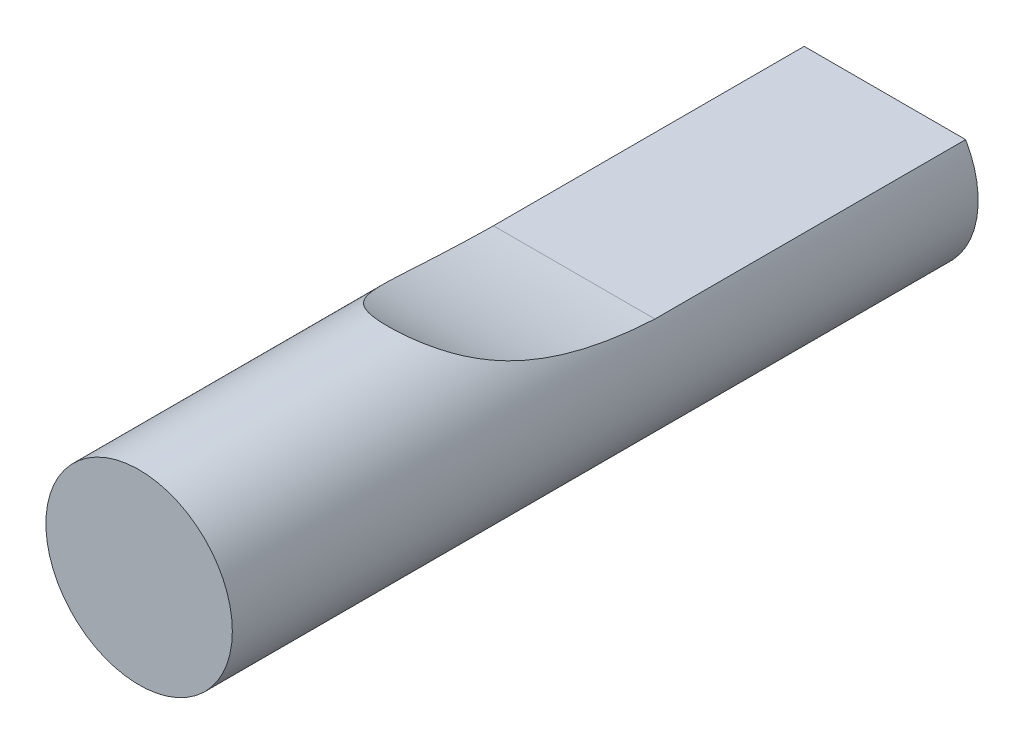
ISO-10303-21;
HEADER;
FILE_DESCRIPTION(('STEP AP214'),'2;1');
FILE_NAME('part.step','',(''),(''),'','','');
FILE_SCHEMA(('AUTOMOTIVE_DESIGN { 1 0 10303 214 1 1 1 1 }'));
ENDSEC;
DATA;
#1=APPLICATION_CONTEXT('core data for automotive mechanical design processes');
#2=APPLICATION_PROTOCOL_DEFINITION('international standard','automotive_design',2000,#1);
#3=PRODUCT_CONTEXT('',#1,'mechanical');
#4=PRODUCT('Part','Part','',(#3));
#5=PRODUCT_RELATED_PRODUCT_CATEGORY('part','',(#4));
#6=PRODUCT_DEFINITION_FORMATION('','',#4);
#7=PRODUCT_DEFINITION_CONTEXT('part definition',#1,'design');
#8=PRODUCT_DEFINITION('design','',#6,#7);
#9=PRODUCT_DEFINITION_SHAPE('','',#8);
#10=(LENGTH_UNIT() NAMED_UNIT(*) SI_UNIT(.MILLI.,.METRE.));
#11=(NAMED_UNIT(*) PLANE_ANGLE_UNIT() SI_UNIT($,.RADIAN.));
#12=(NAMED_UNIT(*) SI_UNIT($,.STERADIAN.) SOLID_ANGLE_UNIT());
#13=UNCERTAINTY_MEASURE_WITH_UNIT(LENGTH_MEASURE(1.E-05),#10,'distance_accuracy_value','');
#14=(GEOMETRIC_REPRESENTATION_CONTEXT(3) GLOBAL_UNCERTAINTY_ASSIGNED_CONTEXT((#13)) GLOBAL_UNIT_ASSIGNED_CONTEXT((#10,
#11,#12)) REPRESENTATION_CONTEXT('',''));
#15=CARTESIAN_POINT('',(0.,0.,0.));
#16=DIRECTION('',(0.,0.,1.));
#17=DIRECTION('',(1.,0.,0.));
#18=AXIS2_PLACEMENT_3D('',#15,#16,#17);
#19=CARTESIAN_POINT('',(0.,0.,5.));
#20=DIRECTION('',(0.,0.,-1.));
#21=DIRECTION('',(-1.,0.,0.));
#22=AXIS2_PLACEMENT_3D('',#19,#20,#21);
#23=CYLINDRICAL_SURFACE('',#22,1.5);
#24=DIRECTION('',(0.,0.,-1.));
#25=VECTOR('',#24,1.);
#26=CARTESIAN_POINT('',(1.29903810567666,0.75,5.));
#27=LINE('',#26,#25);
#28=CARTESIAN_POINT('',(1.29903810567666,0.75,5.));
#29=VERTEX_POINT('',#28);
#30=CARTESIAN_POINT('',(1.29903810567666,0.75,0.));
#31=VERTEX_POINT('',#30);
#32=EDGE_CURVE('E11',#29,#31,#27,.T.);
#33=ORIENTED_EDGE('',*,*,#32,.F.);
#34=CARTESIAN_POINT('',(1.29903810567666,0.75,5.));
#35=CARTESIAN_POINT('',(1.2978953412219,0.75197518335505,5.06048559157463));
#36=CARTESIAN_POINT('',(1.29646459006531,0.75444677100625,5.12095152909596));
#37=CARTESIAN_POINT('',(1.29295600170332,0.760446294831095,5.24184732483891));
#38=CARTESIAN_POINT('',(1.29087778683499,0.763974847481718,5.30227714132617));
#39=CARTESIAN_POINT('',(1.28600383869208,0.772150501527027,5.42304532603629));
#40=CARTESIAN_POINT('',(1.28320796085489,0.776797828270509,5.48338367336792));
#41=CARTESIAN_POINT('',(1.27675222054138,0.787364530830286,5.60491620677999));
#42=CARTESIAN_POINT('',(1.27307877788302,0.793303754319317,5.66610796033986));
#43=CARTESIAN_POINT('',(1.26477336005578,0.806479520341606,5.78827803580516));
#44=CARTESIAN_POINT('',(1.26014154135347,0.813715851080547,5.84925639089998));
#45=CARTESIAN_POINT('',(1.24976649821859,0.829561859161022,5.97093418376337));
#46=CARTESIAN_POINT('',(1.24402336810502,0.838171419943144,6.03163364475493));
#47=CARTESIAN_POINT('',(1.22801393148776,0.86155407428701,6.18322269544039));
#48=CARTESIAN_POINT('',(1.21692760231694,0.877245011558877,6.27388964419227));
#49=CARTESIAN_POINT('',(1.1909719244989,0.9121738522694,6.45404924485086));
#50=CARTESIAN_POINT('',(1.17610097721816,0.931413253641695,6.54354138367448));
#51=CARTESIAN_POINT('',(1.14152156169653,0.973481958859183,6.72009293616242));
#52=CARTESIAN_POINT('',(1.12184657949897,0.996286035660419,6.80716473087454));
#53=CARTESIAN_POINT('',(1.07605099310367,1.0455871837428,6.97848139871011));
#54=CARTESIAN_POINT('',(1.04993788483069,1.07207994477669,7.0627294308774));
#55=CARTESIAN_POINT('',(0.996256793390114,1.12181727507947,7.20773221881972));
#56=CARTESIAN_POINT('',(0.970459360410357,1.14437110955929,7.2693710129311));
#57=CARTESIAN_POINT('',(0.912614876339534,1.19101567317406,7.38918059796711));
#58=CARTESIAN_POINT('',(0.88056182789725,1.21510786211963,7.44734799036929));
#59=CARTESIAN_POINT('',(0.808614257737101,1.26414289977448,7.55916395713599));
#60=CARTESIAN_POINT('',(0.768651848333471,1.28909144782626,7.6127672189678));
#61=CARTESIAN_POINT('',(0.679911730467333,1.3380103028233,7.71266638642869));
#62=CARTESIAN_POINT('',(0.631151181428889,1.36198240455209,7.75897619324597));
#63=CARTESIAN_POINT('',(0.539020234060713,1.40043524855705,7.83030605706416));
#64=CARTESIAN_POINT('',(0.497820608850833,1.41571912199281,7.85768524189821));
#65=CARTESIAN_POINT('',(0.410883176005643,1.44334671086661,7.90603650395782));
#66=CARTESIAN_POINT('',(0.365147705710685,1.45569192956849,7.92701185861031));
#67=CARTESIAN_POINT('',(0.269675282297498,1.47637216375908,7.96161656064762));
#68=CARTESIAN_POINT('',(0.219910819991352,1.48467631882572,7.97518946972829));
#69=CARTESIAN_POINT('',(0.118246155042814,1.49620440130074,7.99392248041527));
#70=CARTESIAN_POINT('',(0.0663471510648342,1.49943114104809,7.99908723928236));
#71=CARTESIAN_POINT('',(-0.0316956590833587,1.50037432204114,8.00060036456341));
#72=CARTESIAN_POINT('',(-0.0778225711104654,1.49867582725086,7.99788479807382));
#73=CARTESIAN_POINT('',(-0.168827933827508,1.491167568095,7.98575031078127));
#74=CARTESIAN_POINT('',(-0.213706595003826,1.48535850129687,7.9763325273485));
#75=CARTESIAN_POINT('',(-0.300243799842686,1.47028956556628,7.9514733169524));
#76=CARTESIAN_POINT('',(-0.341945268838769,1.46109257175312,7.93614141724914));
#77=CARTESIAN_POINT('',(-0.422192211596292,1.43995791271754,7.90010560806907));
#78=CARTESIAN_POINT('',(-0.460736452863065,1.42801918404974,7.87939961371845));
#79=CARTESIAN_POINT('',(-0.549163847561356,1.39693253967497,7.82398613210053));
#80=CARTESIAN_POINT('',(-0.597289094283964,1.37682662682602,7.78700826521245));
#81=CARTESIAN_POINT('',(-0.686187577009365,1.33475735183898,7.70597873265558));
#82=CARTESIAN_POINT('',(-0.726946266120011,1.31279043764503,7.66191338843686));
#83=CARTESIAN_POINT('',(-0.82069010152843,1.25729245365706,7.54474387244914));
#84=CARTESIAN_POINT('',(-0.86932831650602,1.22357027545395,7.46828105329528));
#85=CARTESIAN_POINT('',(-0.954267699145973,1.15855011980008,7.30791243212638));
#86=CARTESIAN_POINT('',(-0.990538912925078,1.12725816800529,7.22398917089738));
#87=CARTESIAN_POINT('',(-1.05194630972312,1.07007241362751,7.05647154339757));
#88=CARTESIAN_POINT('',(-1.07759918757137,1.04397262509955,6.97313088998547));
#89=CARTESIAN_POINT('',(-1.12264514536345,0.995371600955956,6.80371248924597));
#90=CARTESIAN_POINT('',(-1.14203217422343,0.972873854435484,6.71763218374863));
#91=CARTESIAN_POINT('',(-1.17611001105866,0.931388940505655,6.54334607592595));
#92=CARTESIAN_POINT('',(-1.19078063965916,0.912417000625859,6.45513283233135));
#93=CARTESIAN_POINT('',(-1.21643391175507,0.877923219660932,6.27755384125367));
#94=CARTESIAN_POINT('',(-1.22741790335777,0.862400118128768,6.18818852749308));
#95=CARTESIAN_POINT('',(-1.2434329382945,0.839048727414045,6.03764336781224));
#96=CARTESIAN_POINT('',(-1.24924112751482,0.830353925931517,5.97667543541669));
#97=CARTESIAN_POINT('',(-1.2597309709271,0.814352433670794,5.85445622576593));
#98=CARTESIAN_POINT('',(-1.26441253561971,0.807045853182936,5.79320492639367));
#99=CARTESIAN_POINT('',(-1.27280516782188,0.793743428786587,5.67048548931289));
#100=CARTESIAN_POINT('',(-1.27651607664412,0.787747799224671,5.6090173178118));
#101=CARTESIAN_POINT('',(-1.28304421416052,0.777068845076846,5.48678513318483));
#102=CARTESIAN_POINT('',(-1.28587316316266,0.772368415928116,5.42602322778704));
#103=CARTESIAN_POINT('',(-1.29080194287078,0.764103320808031,5.30440608236521));
#104=CARTESIAN_POINT('',(-1.29290192099263,0.760538425215828,5.24355086371449));
#105=CARTESIAN_POINT('',(-1.29644436794133,0.754481640019624,5.12180370125806));
#106=CARTESIAN_POINT('',(-1.29788722462228,0.751989117514921,5.06091180041241));
#107=CARTESIAN_POINT('',(-1.29903810567666,0.75,5.));
#108=B_SPLINE_CURVE_WITH_KNOTS('',3,(#34,#35,#36,#37,#38,#39,#40,#41,#42,#43,#44,#45,#46,#47,
#48,#49,#50,#51,#52,#53,#54,#55,#56,#57,#58,#59,#60,#61,#62,#63,#64,#65,#66,#67,#68,#69,#70,#71,
#72,#73,#74,#75,#76,#77,#78,#79,#80,#81,#82,#83,#84,#85,#86,#87,#88,#89,#90,#91,#92,#93,#94,#95,
#96,#97,#98,#99,#100,#101,#102,#103,#104,#105,#106,#107),.UNSPECIFIED.,.F.,.F.,(4,2,2,2,2,2,2,2,
2,2,2,2,2,2,2,2,2,2,2,2,2,2,2,2,2,2,2,2,2,2,2,2,2,2,2,2,4),(0.,0.181586094224294,
0.363278305811795,0.545007145374545,0.729754679554924,0.914472075214508,1.09917380044465,
1.37708322542416,1.65511023554421,1.93125199866633,2.20707375518182,2.4183479748947,
2.62982575025599,2.84320422679504,3.056170953269,3.21091549759719,3.36558071168012,
3.52140921337311,3.67715137250849,3.81517725790219,3.95317972580492,4.08874045588793,
4.22435385541409,4.4150807896369,4.60618033638254,4.89461740298927,5.18374820570838,
5.45640502630065,5.72932437689692,6.00339634963622,6.27736799191168,6.46291708502242,
6.64848091333925,6.83407505955434,7.01708589257243,7.20005969469926,7.38292535942654),.UNSPECIFIED.);
#109=CARTESIAN_POINT('',(-1.29903810567666,0.75,5.));
#110=VERTEX_POINT('',#109);
#111=EDGE_CURVE('E48',#29,#110,#108,.T.);
#112=ORIENTED_EDGE('',*,*,#111,.T.);
#113=DIRECTION('',(0.,0.,-1.));
#114=VECTOR('',#113,1.);
#115=CARTESIAN_POINT('',(-1.29903810567666,0.75,5.));
#116=LINE('',#115,#114);
#117=CARTESIAN_POINT('',(-1.29903810567666,0.75,0.));
#118=VERTEX_POINT('',#117);
#119=EDGE_CURVE('E42',#110,#118,#116,.T.);
#120=ORIENTED_EDGE('',*,*,#119,.T.);
#121=CARTESIAN_POINT('',(0.,0.,0.));
#122=DIRECTION('',(0.,0.,1.));
#123=DIRECTION('',(1.,0.,0.));
#124=AXIS2_PLACEMENT_3D('',#121,#122,#123);
#125=CIRCLE('',#124,1.5);
#126=EDGE_CURVE('E79',#118,#31,#125,.T.);
#127=ORIENTED_EDGE('',*,*,#126,.T.);
#128=EDGE_LOOP('',(#33,#112,#120,#127));
#129=FACE_BOUND('',#128,.T.);
#130=CARTESIAN_POINT('',(0.,0.,12.));
#131=DIRECTION('',(0.,0.,1.));
#132=DIRECTION('',(1.,0.,0.));
#133=AXIS2_PLACEMENT_3D('',#130,#131,#132);
#134=CIRCLE('',#133,1.5);
#135=CARTESIAN_POINT('',(1.5,0.,12.));
#136=VERTEX_POINT('',#135);
#137=EDGE_CURVE('E64',#136,#136,#134,.T.);
#138=ORIENTED_EDGE('',*,*,#137,.F.);
#139=EDGE_LOOP('',(#138));
#140=FACE_BOUND('',#139,.T.);
#141=ADVANCED_FACE('F32',(#129,#140),#23,.T.);
#142=CARTESIAN_POINT('',(-1.29903810567666,0.75,5.));
#143=DIRECTION('',(0.,-1.,0.));
#144=DIRECTION('',(0.,0.,-1.));
#145=AXIS2_PLACEMENT_3D('',#142,#143,#144);
#146=PLANE('',#145);
#147=DIRECTION('',(-1.,0.,0.));
#148=VECTOR('',#147,1.);
#149=CARTESIAN_POINT('',(-1.29903810567666,0.75,0.));
#150=LINE('',#149,#148);
#151=EDGE_CURVE('E57',#31,#118,#150,.T.);
#152=ORIENTED_EDGE('',*,*,#151,.T.);
#153=ORIENTED_EDGE('',*,*,#119,.F.);
#154=DIRECTION('',(-1.,0.,0.));
#155=VECTOR('',#154,1.);
#156=CARTESIAN_POINT('',(-1.29903810567666,0.75,5.));
#157=LINE('',#156,#155);
#158=EDGE_CURVE('E66',#29,#110,#157,.T.);
#159=ORIENTED_EDGE('',*,*,#158,.F.);
#160=ORIENTED_EDGE('',*,*,#32,.T.);
#161=EDGE_LOOP('',(#152,#153,#159,#160));
#162=FACE_BOUND('',#161,.T.);
#163=ADVANCED_FACE('F70',(#162),#146,.F.);
#164=CARTESIAN_POINT('',(0.,0.,0.));
#165=DIRECTION('',(0.,0.,1.));
#166=DIRECTION('',(1.,0.,0.));
#167=AXIS2_PLACEMENT_3D('',#164,#165,#166);
#168=PLANE('',#167);
#169=ORIENTED_EDGE('',*,*,#126,.F.);
#170=ORIENTED_EDGE('',*,*,#151,.F.);
#171=EDGE_LOOP('',(#169,#170));
#172=FACE_BOUND('',#171,.T.);
#173=ADVANCED_FACE('F88',(#172),#168,.F.);
#174=CARTESIAN_POINT('',(0.,0.,12.));
#175=DIRECTION('',(0.,0.,1.));
#176=DIRECTION('',(1.,0.,0.));
#177=AXIS2_PLACEMENT_3D('',#174,#175,#176);
#178=PLANE('',#177);
#179=ORIENTED_EDGE('',*,*,#137,.T.);
#180=EDGE_LOOP('',(#179));
#181=FACE_BOUND('',#180,.T.);
#182=ADVANCED_FACE('F83',(#181),#178,.T.);
#183=CARTESIAN_POINT('',(-1.5,1.5,8.));
#184=CARTESIAN_POINT('',(-1.5,0.811843176370619,6.89452620501881));
#185=CARTESIAN_POINT('',(-1.5,0.75,5.));
#186=B_SPLINE_CURVE_WITH_KNOTS('',2,(#183,#184,#185),.UNSPECIFIED.,.F.,.F.,(3,3),(0.,
0.697141836276306),.UNSPECIFIED.);
#187=DIRECTION('',(1.,0.,0.));
#188=VECTOR('',#187,1.);
#189=SURFACE_OF_LINEAR_EXTRUSION('',#186,#188);
#190=ORIENTED_EDGE('',*,*,#158,.T.);
#191=ORIENTED_EDGE('',*,*,#111,.F.);
#192=EDGE_LOOP('',(#190,#191));
#193=FACE_BOUND('',#192,.T.);
#194=ADVANCED_FACE('F67',(#193),#189,.F.);
#195=CLOSED_SHELL('',(#141,#163,#173,#182,#194));
#196=MANIFOLD_SOLID_BREP('B2',#195);
#197=ADVANCED_BREP_SHAPE_REPRESENTATION('',(#18,#196),#14);
#198=SHAPE_DEFINITION_REPRESENTATION(#9,#197);
ENDSEC;
END-ISO-10303-21;
